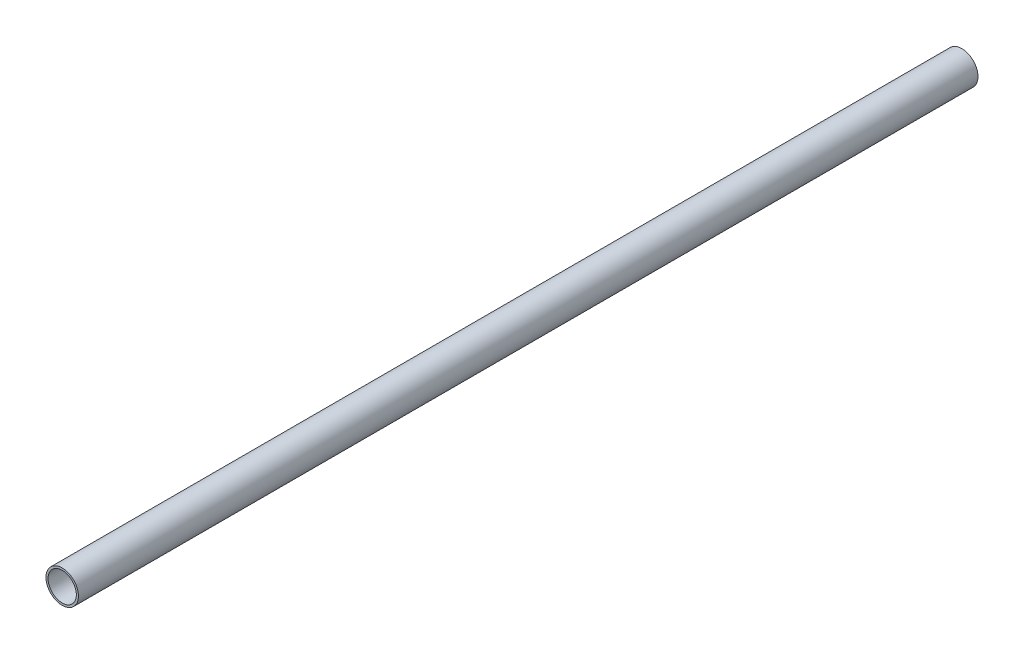
ISO-10303-21;
HEADER;
FILE_DESCRIPTION(('STEP AP214'),'2;1');
FILE_NAME('part.step','',(''),(''),'','','');
FILE_SCHEMA(('AUTOMOTIVE_DESIGN { 1 0 10303 214 1 1 1 1 }'));
ENDSEC;
DATA;
#1=APPLICATION_CONTEXT('core data for automotive mechanical design processes');
#2=APPLICATION_PROTOCOL_DEFINITION('international standard','automotive_design',2000,#1);
#3=PRODUCT_CONTEXT('',#1,'mechanical');
#4=PRODUCT('Part','Part','',(#3));
#5=PRODUCT_RELATED_PRODUCT_CATEGORY('part','',(#4));
#6=PRODUCT_DEFINITION_FORMATION('','',#4);
#7=PRODUCT_DEFINITION_CONTEXT('part definition',#1,'design');
#8=PRODUCT_DEFINITION('design','',#6,#7);
#9=PRODUCT_DEFINITION_SHAPE('','',#8);
#10=(LENGTH_UNIT() NAMED_UNIT(*) SI_UNIT(.MILLI.,.METRE.));
#11=(NAMED_UNIT(*) PLANE_ANGLE_UNIT() SI_UNIT($,.RADIAN.));
#12=(NAMED_UNIT(*) SI_UNIT($,.STERADIAN.) SOLID_ANGLE_UNIT());
#13=UNCERTAINTY_MEASURE_WITH_UNIT(LENGTH_MEASURE(1.E-05),#10,'distance_accuracy_value','');
#14=(GEOMETRIC_REPRESENTATION_CONTEXT(3) GLOBAL_UNCERTAINTY_ASSIGNED_CONTEXT((#13)) GLOBAL_UNIT_ASSIGNED_CONTEXT((#10,
#11,#12)) REPRESENTATION_CONTEXT('',''));
#15=CARTESIAN_POINT('',(0.,0.,0.));
#16=DIRECTION('',(0.,0.,1.));
#17=DIRECTION('',(1.,0.,0.));
#18=AXIS2_PLACEMENT_3D('',#15,#16,#17);
#19=CARTESIAN_POINT('',(0.,0.,220.));
#20=DIRECTION('',(0.,0.,1.));
#21=DIRECTION('',(1.,0.,0.));
#22=AXIS2_PLACEMENT_3D('',#19,#20,#21);
#23=PLANE('',#22);
#24=CARTESIAN_POINT('',(0.,0.,220.));
#25=DIRECTION('',(0.,0.,1.));
#26=DIRECTION('',(1.,0.,0.));
#27=AXIS2_PLACEMENT_3D('',#24,#25,#26);
#28=CIRCLE('',#27,7.9375);
#29=CARTESIAN_POINT('',(7.9375,0.,220.));
#30=VERTEX_POINT('',#29);
#31=EDGE_CURVE('E10',#30,#30,#28,.T.);
#32=ORIENTED_EDGE('',*,*,#31,.T.);
#33=EDGE_LOOP('',(#32));
#34=FACE_BOUND('',#33,.T.);
#35=CARTESIAN_POINT('',(0.,0.,220.));
#36=DIRECTION('',(0.,0.,1.));
#37=DIRECTION('',(1.,0.,0.));
#38=AXIS2_PLACEMENT_3D('',#35,#36,#37);
#39=CIRCLE('',#38,6.9215);
#40=CARTESIAN_POINT('',(6.9215,0.,220.));
#41=VERTEX_POINT('',#40);
#42=EDGE_CURVE('E42',#41,#41,#39,.T.);
#43=ORIENTED_EDGE('',*,*,#42,.F.);
#44=EDGE_LOOP('',(#43));
#45=FACE_BOUND('',#44,.T.);
#46=ADVANCED_FACE('F31',(#34,#45),#23,.T.);
#47=CARTESIAN_POINT('',(0.,0.,-220.));
#48=DIRECTION('',(0.,0.,1.));
#49=DIRECTION('',(1.,0.,0.));
#50=AXIS2_PLACEMENT_3D('',#47,#48,#49);
#51=PLANE('',#50);
#52=CARTESIAN_POINT('',(0.,0.,-220.));
#53=DIRECTION('',(0.,0.,1.));
#54=DIRECTION('',(1.,0.,0.));
#55=AXIS2_PLACEMENT_3D('',#52,#53,#54);
#56=CIRCLE('',#55,7.9375);
#57=CARTESIAN_POINT('',(7.9375,0.,-220.));
#58=VERTEX_POINT('',#57);
#59=EDGE_CURVE('E35',#58,#58,#56,.T.);
#60=ORIENTED_EDGE('',*,*,#59,.F.);
#61=EDGE_LOOP('',(#60));
#62=FACE_BOUND('',#61,.T.);
#63=CARTESIAN_POINT('',(0.,0.,-220.));
#64=DIRECTION('',(0.,0.,1.));
#65=DIRECTION('',(1.,0.,0.));
#66=AXIS2_PLACEMENT_3D('',#63,#64,#65);
#67=CIRCLE('',#66,6.9215);
#68=CARTESIAN_POINT('',(6.9215,0.,-220.));
#69=VERTEX_POINT('',#68);
#70=EDGE_CURVE('E44',#69,#69,#67,.T.);
#71=ORIENTED_EDGE('',*,*,#70,.T.);
#72=EDGE_LOOP('',(#71));
#73=FACE_BOUND('',#72,.T.);
#74=ADVANCED_FACE('F54',(#62,#73),#51,.F.);
#75=CARTESIAN_POINT('',(0.,0.,220.));
#76=DIRECTION('',(0.,0.,-1.));
#77=DIRECTION('',(-1.,0.,0.));
#78=AXIS2_PLACEMENT_3D('',#75,#76,#77);
#79=CYLINDRICAL_SURFACE('',#78,7.9375);
#80=ORIENTED_EDGE('',*,*,#31,.F.);
#81=EDGE_LOOP('',(#80));
#82=FACE_BOUND('',#81,.T.);
#83=ORIENTED_EDGE('',*,*,#59,.T.);
#84=EDGE_LOOP('',(#83));
#85=FACE_BOUND('',#84,.T.);
#86=ADVANCED_FACE('F33',(#82,#85),#79,.T.);
#87=CARTESIAN_POINT('',(0.,0.,220.));
#88=DIRECTION('',(0.,0.,-1.));
#89=DIRECTION('',(-1.,0.,0.));
#90=AXIS2_PLACEMENT_3D('',#87,#88,#89);
#91=CYLINDRICAL_SURFACE('',#90,6.9215);
#92=ORIENTED_EDGE('',*,*,#42,.T.);
#93=EDGE_LOOP('',(#92));
#94=FACE_BOUND('',#93,.T.);
#95=ORIENTED_EDGE('',*,*,#70,.F.);
#96=EDGE_LOOP('',(#95));
#97=FACE_BOUND('',#96,.T.);
#98=ADVANCED_FACE('F50',(#94,#97),#91,.F.);
#99=CLOSED_SHELL('',(#46,#74,#86,#98));
#100=MANIFOLD_SOLID_BREP('B2',#99);
#101=ADVANCED_BREP_SHAPE_REPRESENTATION('',(#18,#100),#14);
#102=SHAPE_DEFINITION_REPRESENTATION(#9,#101);
ENDSEC;
END-ISO-10303-21;
